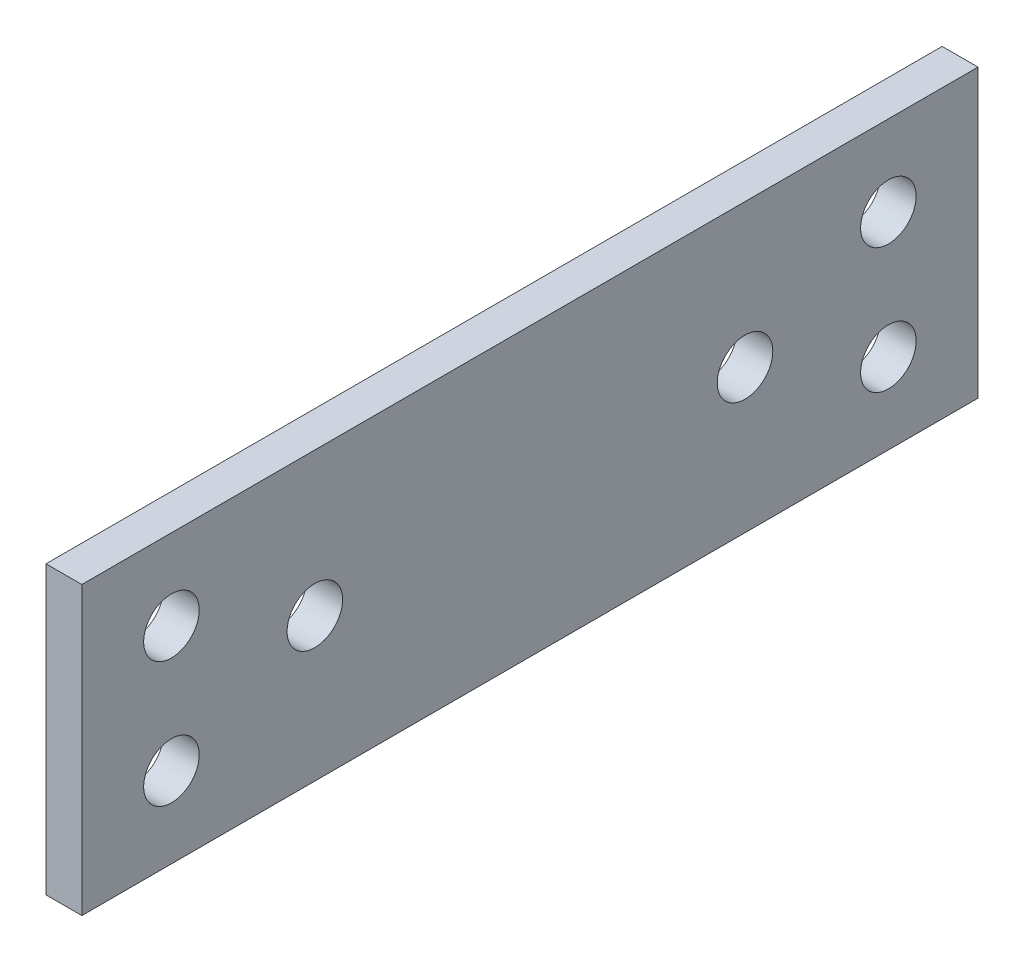
ISO-10303-21;
HEADER;
FILE_DESCRIPTION(('STEP AP214'),'2;1');
FILE_NAME('part.step','',(''),(''),'','','');
FILE_SCHEMA(('AUTOMOTIVE_DESIGN { 1 0 10303 214 1 1 1 1 }'));
ENDSEC;
DATA;
#1=APPLICATION_CONTEXT('core data for automotive mechanical design processes');
#2=APPLICATION_PROTOCOL_DEFINITION('international standard','automotive_design',2000,#1);
#3=PRODUCT_CONTEXT('',#1,'mechanical');
#4=PRODUCT('Part','Part','',(#3));
#5=PRODUCT_RELATED_PRODUCT_CATEGORY('part','',(#4));
#6=PRODUCT_DEFINITION_FORMATION('','',#4);
#7=PRODUCT_DEFINITION_CONTEXT('part definition',#1,'design');
#8=PRODUCT_DEFINITION('design','',#6,#7);
#9=PRODUCT_DEFINITION_SHAPE('','',#8);
#10=(LENGTH_UNIT() NAMED_UNIT(*) SI_UNIT(.MILLI.,.METRE.));
#11=(NAMED_UNIT(*) PLANE_ANGLE_UNIT() SI_UNIT($,.RADIAN.));
#12=(NAMED_UNIT(*) SI_UNIT($,.STERADIAN.) SOLID_ANGLE_UNIT());
#13=UNCERTAINTY_MEASURE_WITH_UNIT(LENGTH_MEASURE(1.E-05),#10,'distance_accuracy_value','');
#14=(GEOMETRIC_REPRESENTATION_CONTEXT(3) GLOBAL_UNCERTAINTY_ASSIGNED_CONTEXT((#13)) GLOBAL_UNIT_ASSIGNED_CONTEXT((#10,
#11,#12)) REPRESENTATION_CONTEXT('',''));
#15=CARTESIAN_POINT('',(0.,0.,0.));
#16=DIRECTION('',(0.,0.,1.));
#17=DIRECTION('',(1.,0.,0.));
#18=AXIS2_PLACEMENT_3D('',#15,#16,#17);
#19=CARTESIAN_POINT('',(2.,0.,0.));
#20=DIRECTION('',(1.,0.,0.));
#21=DIRECTION('',(0.,0.,-1.));
#22=AXIS2_PLACEMENT_3D('',#19,#20,#21);
#23=PLANE('',#22);
#24=CARTESIAN_POINT('',(2.,-3.5,-20.));
#25=DIRECTION('',(1.,0.,0.));
#26=DIRECTION('',(0.,0.,-1.));
#27=AXIS2_PLACEMENT_3D('',#24,#25,#26);
#28=CIRCLE('',#27,1.55);
#29=CARTESIAN_POINT('',(2.,-3.5,-21.55));
#30=VERTEX_POINT('',#29);
#31=EDGE_CURVE('E134',#30,#30,#28,.T.);
#32=ORIENTED_EDGE('',*,*,#31,.F.);
#33=EDGE_LOOP('',(#32));
#34=FACE_BOUND('',#33,.T.);
#35=CARTESIAN_POINT('',(2.,-3.5,20.));
#36=DIRECTION('',(1.,0.,0.));
#37=DIRECTION('',(0.,0.,-1.));
#38=AXIS2_PLACEMENT_3D('',#35,#36,#37);
#39=CIRCLE('',#38,1.55);
#40=CARTESIAN_POINT('',(2.,-3.5,18.45));
#41=VERTEX_POINT('',#40);
#42=EDGE_CURVE('E122',#41,#41,#39,.T.);
#43=ORIENTED_EDGE('',*,*,#42,.F.);
#44=EDGE_LOOP('',(#43));
#45=FACE_BOUND('',#44,.T.);
#46=CARTESIAN_POINT('',(2.,0.,12.));
#47=DIRECTION('',(1.,0.,0.));
#48=DIRECTION('',(0.,0.,-1.));
#49=AXIS2_PLACEMENT_3D('',#46,#47,#48);
#50=CIRCLE('',#49,1.55);
#51=CARTESIAN_POINT('',(2.,0.,10.45));
#52=VERTEX_POINT('',#51);
#53=EDGE_CURVE('E101',#52,#52,#50,.T.);
#54=ORIENTED_EDGE('',*,*,#53,.F.);
#55=EDGE_LOOP('',(#54));
#56=FACE_BOUND('',#55,.T.);
#57=DIRECTION('',(0.,-1.,0.));
#58=VECTOR('',#57,1.);
#59=CARTESIAN_POINT('',(2.,-8.00000000000001,25.));
#60=LINE('',#59,#58);
#61=CARTESIAN_POINT('',(2.,7.99999999999999,25.));
#62=VERTEX_POINT('',#61);
#63=CARTESIAN_POINT('',(2.,-8.00000000000001,25.));
#64=VERTEX_POINT('',#63);
#65=EDGE_CURVE('E86',#62,#64,#60,.T.);
#66=ORIENTED_EDGE('',*,*,#65,.T.);
#67=DIRECTION('',(0.,0.,-1.));
#68=VECTOR('',#67,1.);
#69=CARTESIAN_POINT('',(2.,-8.,-25.));
#70=LINE('',#69,#68);
#71=CARTESIAN_POINT('',(2.,-8.,-25.));
#72=VERTEX_POINT('',#71);
#73=EDGE_CURVE('E81',#64,#72,#70,.T.);
#74=ORIENTED_EDGE('',*,*,#73,.T.);
#75=DIRECTION('',(0.,1.,0.));
#76=VECTOR('',#75,1.);
#77=CARTESIAN_POINT('',(2.,-8.,-25.));
#78=LINE('',#77,#76);
#79=CARTESIAN_POINT('',(2.,8.,-25.));
#80=VERTEX_POINT('',#79);
#81=EDGE_CURVE('E84',#72,#80,#78,.T.);
#82=ORIENTED_EDGE('',*,*,#81,.T.);
#83=DIRECTION('',(0.,0.,1.));
#84=VECTOR('',#83,1.);
#85=CARTESIAN_POINT('',(2.,8.,-25.));
#86=LINE('',#85,#84);
#87=EDGE_CURVE('E51',#80,#62,#86,.T.);
#88=ORIENTED_EDGE('',*,*,#87,.T.);
#89=EDGE_LOOP('',(#66,#74,#82,#88));
#90=FACE_BOUND('',#89,.T.);
#91=CARTESIAN_POINT('',(2.,3.5,20.));
#92=DIRECTION('',(1.,0.,0.));
#93=DIRECTION('',(0.,0.,-1.));
#94=AXIS2_PLACEMENT_3D('',#91,#92,#93);
#95=CIRCLE('',#94,1.55);
#96=CARTESIAN_POINT('',(2.,3.5,18.45));
#97=VERTEX_POINT('',#96);
#98=EDGE_CURVE('E116',#97,#97,#95,.T.);
#99=ORIENTED_EDGE('',*,*,#98,.F.);
#100=EDGE_LOOP('',(#99));
#101=FACE_BOUND('',#100,.T.);
#102=CARTESIAN_POINT('',(2.,3.5,-20.));
#103=DIRECTION('',(1.,0.,0.));
#104=DIRECTION('',(0.,0.,-1.));
#105=AXIS2_PLACEMENT_3D('',#102,#103,#104);
#106=CIRCLE('',#105,1.55);
#107=CARTESIAN_POINT('',(2.,3.5,-21.55));
#108=VERTEX_POINT('',#107);
#109=EDGE_CURVE('E128',#108,#108,#106,.T.);
#110=ORIENTED_EDGE('',*,*,#109,.F.);
#111=EDGE_LOOP('',(#110));
#112=FACE_BOUND('',#111,.T.);
#113=CARTESIAN_POINT('',(2.,0.,-12.));
#114=DIRECTION('',(1.,0.,0.));
#115=DIRECTION('',(0.,0.,-1.));
#116=AXIS2_PLACEMENT_3D('',#113,#114,#115);
#117=CIRCLE('',#116,1.55);
#118=CARTESIAN_POINT('',(2.,0.,-13.55));
#119=VERTEX_POINT('',#118);
#120=EDGE_CURVE('E140',#119,#119,#117,.T.);
#121=ORIENTED_EDGE('',*,*,#120,.F.);
#122=EDGE_LOOP('',(#121));
#123=FACE_BOUND('',#122,.T.);
#124=ADVANCED_FACE('F34',(#34,#45,#56,#90,#101,#112,#123),#23,.T.);
#125=CARTESIAN_POINT('',(0.,0.,0.));
#126=DIRECTION('',(1.,0.,0.));
#127=DIRECTION('',(0.,0.,-1.));
#128=AXIS2_PLACEMENT_3D('',#125,#126,#127);
#129=PLANE('',#128);
#130=DIRECTION('',(0.,-1.,0.));
#131=VECTOR('',#130,1.);
#132=CARTESIAN_POINT('',(0.,-8.00000000000001,25.));
#133=LINE('',#132,#131);
#134=CARTESIAN_POINT('',(0.,7.99999999999999,25.));
#135=VERTEX_POINT('',#134);
#136=CARTESIAN_POINT('',(0.,-8.00000000000001,25.));
#137=VERTEX_POINT('',#136);
#138=EDGE_CURVE('E98',#135,#137,#133,.T.);
#139=ORIENTED_EDGE('',*,*,#138,.F.);
#140=DIRECTION('',(0.,0.,1.));
#141=VECTOR('',#140,1.);
#142=CARTESIAN_POINT('',(0.,8.,-25.));
#143=LINE('',#142,#141);
#144=CARTESIAN_POINT('',(0.,8.,-25.));
#145=VERTEX_POINT('',#144);
#146=EDGE_CURVE('E74',#145,#135,#143,.T.);
#147=ORIENTED_EDGE('',*,*,#146,.F.);
#148=DIRECTION('',(0.,1.,0.));
#149=VECTOR('',#148,1.);
#150=CARTESIAN_POINT('',(0.,-8.,-25.));
#151=LINE('',#150,#149);
#152=CARTESIAN_POINT('',(0.,-8.,-25.));
#153=VERTEX_POINT('',#152);
#154=EDGE_CURVE('E68',#153,#145,#151,.T.);
#155=ORIENTED_EDGE('',*,*,#154,.F.);
#156=DIRECTION('',(0.,0.,-1.));
#157=VECTOR('',#156,1.);
#158=CARTESIAN_POINT('',(0.,-8.,-25.));
#159=LINE('',#158,#157);
#160=EDGE_CURVE('E90',#137,#153,#159,.T.);
#161=ORIENTED_EDGE('',*,*,#160,.F.);
#162=EDGE_LOOP('',(#139,#147,#155,#161));
#163=FACE_BOUND('',#162,.T.);
#164=CARTESIAN_POINT('',(0.,0.,12.));
#165=DIRECTION('',(1.,0.,0.));
#166=DIRECTION('',(0.,0.,-1.));
#167=AXIS2_PLACEMENT_3D('',#164,#165,#166);
#168=CIRCLE('',#167,1.55);
#169=CARTESIAN_POINT('',(0.,0.,10.45));
#170=VERTEX_POINT('',#169);
#171=EDGE_CURVE('E113',#170,#170,#168,.T.);
#172=ORIENTED_EDGE('',*,*,#171,.T.);
#173=EDGE_LOOP('',(#172));
#174=FACE_BOUND('',#173,.T.);
#175=CARTESIAN_POINT('',(0.,3.5,20.));
#176=DIRECTION('',(1.,0.,0.));
#177=DIRECTION('',(0.,0.,-1.));
#178=AXIS2_PLACEMENT_3D('',#175,#176,#177);
#179=CIRCLE('',#178,1.55);
#180=CARTESIAN_POINT('',(0.,3.5,18.45));
#181=VERTEX_POINT('',#180);
#182=EDGE_CURVE('E119',#181,#181,#179,.T.);
#183=ORIENTED_EDGE('',*,*,#182,.T.);
#184=EDGE_LOOP('',(#183));
#185=FACE_BOUND('',#184,.T.);
#186=CARTESIAN_POINT('',(0.,-3.5,20.));
#187=DIRECTION('',(1.,0.,0.));
#188=DIRECTION('',(0.,0.,-1.));
#189=AXIS2_PLACEMENT_3D('',#186,#187,#188);
#190=CIRCLE('',#189,1.55);
#191=CARTESIAN_POINT('',(0.,-3.5,18.45));
#192=VERTEX_POINT('',#191);
#193=EDGE_CURVE('E125',#192,#192,#190,.T.);
#194=ORIENTED_EDGE('',*,*,#193,.T.);
#195=EDGE_LOOP('',(#194));
#196=FACE_BOUND('',#195,.T.);
#197=CARTESIAN_POINT('',(0.,3.5,-20.));
#198=DIRECTION('',(1.,0.,0.));
#199=DIRECTION('',(0.,0.,-1.));
#200=AXIS2_PLACEMENT_3D('',#197,#198,#199);
#201=CIRCLE('',#200,1.55);
#202=CARTESIAN_POINT('',(0.,3.5,-21.55));
#203=VERTEX_POINT('',#202);
#204=EDGE_CURVE('E131',#203,#203,#201,.T.);
#205=ORIENTED_EDGE('',*,*,#204,.T.);
#206=EDGE_LOOP('',(#205));
#207=FACE_BOUND('',#206,.T.);
#208=CARTESIAN_POINT('',(0.,-3.5,-20.));
#209=DIRECTION('',(1.,0.,0.));
#210=DIRECTION('',(0.,0.,-1.));
#211=AXIS2_PLACEMENT_3D('',#208,#209,#210);
#212=CIRCLE('',#211,1.55);
#213=CARTESIAN_POINT('',(0.,-3.5,-21.55));
#214=VERTEX_POINT('',#213);
#215=EDGE_CURVE('E137',#214,#214,#212,.T.);
#216=ORIENTED_EDGE('',*,*,#215,.T.);
#217=EDGE_LOOP('',(#216));
#218=FACE_BOUND('',#217,.T.);
#219=CARTESIAN_POINT('',(0.,0.,-12.));
#220=DIRECTION('',(1.,0.,0.));
#221=DIRECTION('',(0.,0.,-1.));
#222=AXIS2_PLACEMENT_3D('',#219,#220,#221);
#223=CIRCLE('',#222,1.55);
#224=CARTESIAN_POINT('',(0.,0.,-13.55));
#225=VERTEX_POINT('',#224);
#226=EDGE_CURVE('E143',#225,#225,#223,.T.);
#227=ORIENTED_EDGE('',*,*,#226,.T.);
#228=EDGE_LOOP('',(#227));
#229=FACE_BOUND('',#228,.T.);
#230=ADVANCED_FACE('F109',(#163,#174,#185,#196,#207,#218,#229),#129,.F.);
#231=CARTESIAN_POINT('',(2.,-8.00000000000001,25.));
#232=DIRECTION('',(0.,0.,-1.));
#233=DIRECTION('',(-1.,0.,0.));
#234=AXIS2_PLACEMENT_3D('',#231,#232,#233);
#235=PLANE('',#234);
#236=ORIENTED_EDGE('',*,*,#138,.T.);
#237=DIRECTION('',(-1.,0.,0.));
#238=VECTOR('',#237,1.);
#239=CARTESIAN_POINT('',(2.,-8.00000000000001,25.));
#240=LINE('',#239,#238);
#241=EDGE_CURVE('E11',#64,#137,#240,.T.);
#242=ORIENTED_EDGE('',*,*,#241,.F.);
#243=ORIENTED_EDGE('',*,*,#65,.F.);
#244=DIRECTION('',(-1.,0.,0.));
#245=VECTOR('',#244,1.);
#246=CARTESIAN_POINT('',(2.,7.99999999999999,25.));
#247=LINE('',#246,#245);
#248=EDGE_CURVE('E94',#62,#135,#247,.T.);
#249=ORIENTED_EDGE('',*,*,#248,.T.);
#250=EDGE_LOOP('',(#236,#242,#243,#249));
#251=FACE_BOUND('',#250,.T.);
#252=ADVANCED_FACE('F36',(#251),#235,.F.);
#253=CARTESIAN_POINT('',(2.,-8.,-25.));
#254=DIRECTION('',(0.,1.,0.));
#255=DIRECTION('',(0.,0.,1.));
#256=AXIS2_PLACEMENT_3D('',#253,#254,#255);
#257=PLANE('',#256);
#258=ORIENTED_EDGE('',*,*,#160,.T.);
#259=DIRECTION('',(-1.,0.,0.));
#260=VECTOR('',#259,1.);
#261=CARTESIAN_POINT('',(2.,-8.,-25.));
#262=LINE('',#261,#260);
#263=EDGE_CURVE('E43',#72,#153,#262,.T.);
#264=ORIENTED_EDGE('',*,*,#263,.F.);
#265=ORIENTED_EDGE('',*,*,#73,.F.);
#266=ORIENTED_EDGE('',*,*,#241,.T.);
#267=EDGE_LOOP('',(#258,#264,#265,#266));
#268=FACE_BOUND('',#267,.T.);
#269=ADVANCED_FACE('F89',(#268),#257,.F.);
#270=CARTESIAN_POINT('',(2.,-8.,-25.));
#271=DIRECTION('',(0.,0.,1.));
#272=DIRECTION('',(1.,0.,0.));
#273=AXIS2_PLACEMENT_3D('',#270,#271,#272);
#274=PLANE('',#273);
#275=ORIENTED_EDGE('',*,*,#154,.T.);
#276=DIRECTION('',(-1.,0.,0.));
#277=VECTOR('',#276,1.);
#278=CARTESIAN_POINT('',(2.,8.,-25.));
#279=LINE('',#278,#277);
#280=EDGE_CURVE('E91',#80,#145,#279,.T.);
#281=ORIENTED_EDGE('',*,*,#280,.F.);
#282=ORIENTED_EDGE('',*,*,#81,.F.);
#283=ORIENTED_EDGE('',*,*,#263,.T.);
#284=EDGE_LOOP('',(#275,#281,#282,#283));
#285=FACE_BOUND('',#284,.T.);
#286=ADVANCED_FACE('F92',(#285),#274,.F.);
#287=CARTESIAN_POINT('',(2.,8.,-25.));
#288=DIRECTION('',(0.,-1.,0.));
#289=DIRECTION('',(0.,0.,-1.));
#290=AXIS2_PLACEMENT_3D('',#287,#288,#289);
#291=PLANE('',#290);
#292=ORIENTED_EDGE('',*,*,#146,.T.);
#293=ORIENTED_EDGE('',*,*,#248,.F.);
#294=ORIENTED_EDGE('',*,*,#87,.F.);
#295=ORIENTED_EDGE('',*,*,#280,.T.);
#296=EDGE_LOOP('',(#292,#293,#294,#295));
#297=FACE_BOUND('',#296,.T.);
#298=ADVANCED_FACE('F106',(#297),#291,.F.);
#299=CARTESIAN_POINT('',(2.,0.,12.));
#300=DIRECTION('',(-1.,0.,0.));
#301=DIRECTION('',(0.,0.,1.));
#302=AXIS2_PLACEMENT_3D('',#299,#300,#301);
#303=CYLINDRICAL_SURFACE('',#302,1.55);
#304=ORIENTED_EDGE('',*,*,#53,.T.);
#305=EDGE_LOOP('',(#304));
#306=FACE_BOUND('',#305,.T.);
#307=ORIENTED_EDGE('',*,*,#171,.F.);
#308=EDGE_LOOP('',(#307));
#309=FACE_BOUND('',#308,.T.);
#310=ADVANCED_FACE('F162',(#306,#309),#303,.F.);
#311=CARTESIAN_POINT('',(2.,3.5,20.));
#312=DIRECTION('',(-1.,0.,0.));
#313=DIRECTION('',(0.,0.,1.));
#314=AXIS2_PLACEMENT_3D('',#311,#312,#313);
#315=CYLINDRICAL_SURFACE('',#314,1.55);
#316=ORIENTED_EDGE('',*,*,#98,.T.);
#317=EDGE_LOOP('',(#316));
#318=FACE_BOUND('',#317,.T.);
#319=ORIENTED_EDGE('',*,*,#182,.F.);
#320=EDGE_LOOP('',(#319));
#321=FACE_BOUND('',#320,.T.);
#322=ADVANCED_FACE('F208',(#318,#321),#315,.F.);
#323=CARTESIAN_POINT('',(2.,-3.5,20.));
#324=DIRECTION('',(-1.,0.,0.));
#325=DIRECTION('',(0.,0.,1.));
#326=AXIS2_PLACEMENT_3D('',#323,#324,#325);
#327=CYLINDRICAL_SURFACE('',#326,1.55);
#328=ORIENTED_EDGE('',*,*,#42,.T.);
#329=EDGE_LOOP('',(#328));
#330=FACE_BOUND('',#329,.T.);
#331=ORIENTED_EDGE('',*,*,#193,.F.);
#332=EDGE_LOOP('',(#331));
#333=FACE_BOUND('',#332,.T.);
#334=ADVANCED_FACE('F216',(#330,#333),#327,.F.);
#335=CARTESIAN_POINT('',(2.,3.5,-20.));
#336=DIRECTION('',(-1.,0.,0.));
#337=DIRECTION('',(0.,0.,1.));
#338=AXIS2_PLACEMENT_3D('',#335,#336,#337);
#339=CYLINDRICAL_SURFACE('',#338,1.55);
#340=ORIENTED_EDGE('',*,*,#109,.T.);
#341=EDGE_LOOP('',(#340));
#342=FACE_BOUND('',#341,.T.);
#343=ORIENTED_EDGE('',*,*,#204,.F.);
#344=EDGE_LOOP('',(#343));
#345=FACE_BOUND('',#344,.T.);
#346=ADVANCED_FACE('F224',(#342,#345),#339,.F.);
#347=CARTESIAN_POINT('',(2.,-3.5,-20.));
#348=DIRECTION('',(-1.,0.,0.));
#349=DIRECTION('',(0.,0.,1.));
#350=AXIS2_PLACEMENT_3D('',#347,#348,#349);
#351=CYLINDRICAL_SURFACE('',#350,1.55);
#352=ORIENTED_EDGE('',*,*,#31,.T.);
#353=EDGE_LOOP('',(#352));
#354=FACE_BOUND('',#353,.T.);
#355=ORIENTED_EDGE('',*,*,#215,.F.);
#356=EDGE_LOOP('',(#355));
#357=FACE_BOUND('',#356,.T.);
#358=ADVANCED_FACE('F233',(#354,#357),#351,.F.);
#359=CARTESIAN_POINT('',(2.,0.,-12.));
#360=DIRECTION('',(-1.,0.,0.));
#361=DIRECTION('',(0.,0.,1.));
#362=AXIS2_PLACEMENT_3D('',#359,#360,#361);
#363=CYLINDRICAL_SURFACE('',#362,1.55);
#364=ORIENTED_EDGE('',*,*,#120,.T.);
#365=EDGE_LOOP('',(#364));
#366=FACE_BOUND('',#365,.T.);
#367=ORIENTED_EDGE('',*,*,#226,.F.);
#368=EDGE_LOOP('',(#367));
#369=FACE_BOUND('',#368,.T.);
#370=ADVANCED_FACE('F149',(#366,#369),#363,.F.);
#371=CLOSED_SHELL('',(#124,#230,#252,#269,#286,#298,#310,#322,#334,#346,#358,#370));
#372=MANIFOLD_SOLID_BREP('B2',#371);
#373=ADVANCED_BREP_SHAPE_REPRESENTATION('',(#18,#372),#14);
#374=SHAPE_DEFINITION_REPRESENTATION(#9,#373);
ENDSEC;
END-ISO-10303-21;
